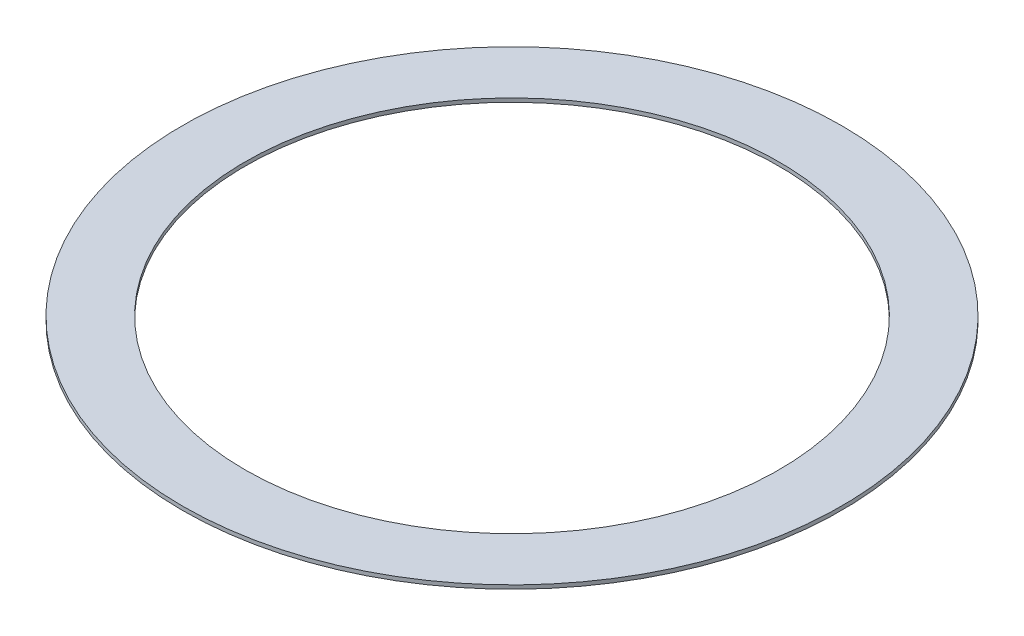
ISO-10303-21;
HEADER;
FILE_DESCRIPTION(('STEP AP214'),'2;1');
FILE_NAME('part.step','',(''),(''),'','','');
FILE_SCHEMA(('AUTOMOTIVE_DESIGN { 1 0 10303 214 1 1 1 1 }'));
ENDSEC;
DATA;
#1=APPLICATION_CONTEXT('core data for automotive mechanical design processes');
#2=APPLICATION_PROTOCOL_DEFINITION('international standard','automotive_design',2000,#1);
#3=PRODUCT_CONTEXT('',#1,'mechanical');
#4=PRODUCT('Part','Part','',(#3));
#5=PRODUCT_RELATED_PRODUCT_CATEGORY('part','',(#4));
#6=PRODUCT_DEFINITION_FORMATION('','',#4);
#7=PRODUCT_DEFINITION_CONTEXT('part definition',#1,'design');
#8=PRODUCT_DEFINITION('design','',#6,#7);
#9=PRODUCT_DEFINITION_SHAPE('','',#8);
#10=(LENGTH_UNIT() NAMED_UNIT(*) SI_UNIT(.MILLI.,.METRE.));
#11=(NAMED_UNIT(*) PLANE_ANGLE_UNIT() SI_UNIT($,.RADIAN.));
#12=(NAMED_UNIT(*) SI_UNIT($,.STERADIAN.) SOLID_ANGLE_UNIT());
#13=UNCERTAINTY_MEASURE_WITH_UNIT(LENGTH_MEASURE(1.E-05),#10,'distance_accuracy_value','');
#14=(GEOMETRIC_REPRESENTATION_CONTEXT(3) GLOBAL_UNCERTAINTY_ASSIGNED_CONTEXT((#13)) GLOBAL_UNIT_ASSIGNED_CONTEXT((#10,
#11,#12)) REPRESENTATION_CONTEXT('',''));
#15=CARTESIAN_POINT('',(0.,0.,0.));
#16=DIRECTION('',(0.,0.,1.));
#17=DIRECTION('',(1.,0.,0.));
#18=AXIS2_PLACEMENT_3D('',#15,#16,#17);
#19=CARTESIAN_POINT('',(0.,5.,0.));
#20=DIRECTION('',(0.,1.,0.));
#21=DIRECTION('',(0.,0.,1.));
#22=AXIS2_PLACEMENT_3D('',#19,#20,#21);
#23=PLANE('',#22);
#24=CARTESIAN_POINT('',(0.,5.,0.));
#25=DIRECTION('',(0.,1.,0.));
#26=DIRECTION('',(0.,0.,1.));
#27=AXIS2_PLACEMENT_3D('',#24,#25,#26);
#28=CIRCLE('',#27,435.);
#29=CARTESIAN_POINT('',(0.,5.,435.));
#30=VERTEX_POINT('',#29);
#31=EDGE_CURVE('E10',#30,#30,#28,.T.);
#32=ORIENTED_EDGE('',*,*,#31,.T.);
#33=EDGE_LOOP('',(#32));
#34=FACE_BOUND('',#33,.T.);
#35=CARTESIAN_POINT('',(0.,5.,0.));
#36=DIRECTION('',(0.,1.,0.));
#37=DIRECTION('',(0.,0.,1.));
#38=AXIS2_PLACEMENT_3D('',#35,#36,#37);
#39=CIRCLE('',#38,352.26);
#40=CARTESIAN_POINT('',(0.,5.,352.26));
#41=VERTEX_POINT('',#40);
#42=EDGE_CURVE('E50',#41,#41,#39,.T.);
#43=ORIENTED_EDGE('',*,*,#42,.F.);
#44=EDGE_LOOP('',(#43));
#45=FACE_BOUND('',#44,.T.);
#46=ADVANCED_FACE('F37',(#34,#45),#23,.T.);
#47=CARTESIAN_POINT('',(0.,0.,0.));
#48=DIRECTION('',(0.,1.,0.));
#49=DIRECTION('',(0.,0.,1.));
#50=AXIS2_PLACEMENT_3D('',#47,#48,#49);
#51=PLANE('',#50);
#52=CARTESIAN_POINT('',(0.,0.,0.));
#53=DIRECTION('',(0.,1.,0.));
#54=DIRECTION('',(0.,0.,1.));
#55=AXIS2_PLACEMENT_3D('',#52,#53,#54);
#56=CIRCLE('',#55,435.);
#57=CARTESIAN_POINT('',(0.,0.,435.));
#58=VERTEX_POINT('',#57);
#59=EDGE_CURVE('E41',#58,#58,#56,.T.);
#60=ORIENTED_EDGE('',*,*,#59,.F.);
#61=EDGE_LOOP('',(#60));
#62=FACE_BOUND('',#61,.T.);
#63=CARTESIAN_POINT('',(0.,0.,0.));
#64=DIRECTION('',(0.,1.,0.));
#65=DIRECTION('',(0.,0.,1.));
#66=AXIS2_PLACEMENT_3D('',#63,#64,#65);
#67=CIRCLE('',#66,352.26);
#68=CARTESIAN_POINT('',(0.,0.,352.26));
#69=VERTEX_POINT('',#68);
#70=EDGE_CURVE('E52',#69,#69,#67,.T.);
#71=ORIENTED_EDGE('',*,*,#70,.T.);
#72=EDGE_LOOP('',(#71));
#73=FACE_BOUND('',#72,.T.);
#74=ADVANCED_FACE('F64',(#62,#73),#51,.F.);
#75=CARTESIAN_POINT('',(0.,5.,0.));
#76=DIRECTION('',(0.,-1.,0.));
#77=DIRECTION('',(0.,0.,-1.));
#78=AXIS2_PLACEMENT_3D('',#75,#76,#77);
#79=CYLINDRICAL_SURFACE('',#78,435.);
#80=ORIENTED_EDGE('',*,*,#31,.F.);
#81=EDGE_LOOP('',(#80));
#82=FACE_BOUND('',#81,.T.);
#83=ORIENTED_EDGE('',*,*,#59,.T.);
#84=EDGE_LOOP('',(#83));
#85=FACE_BOUND('',#84,.T.);
#86=ADVANCED_FACE('F39',(#82,#85),#79,.T.);
#87=CARTESIAN_POINT('',(0.,5.,0.));
#88=DIRECTION('',(0.,-1.,0.));
#89=DIRECTION('',(0.,0.,-1.));
#90=AXIS2_PLACEMENT_3D('',#87,#88,#89);
#91=CYLINDRICAL_SURFACE('',#90,352.26);
#92=ORIENTED_EDGE('',*,*,#42,.T.);
#93=EDGE_LOOP('',(#92));
#94=FACE_BOUND('',#93,.T.);
#95=ORIENTED_EDGE('',*,*,#70,.F.);
#96=EDGE_LOOP('',(#95));
#97=FACE_BOUND('',#96,.T.);
#98=ADVANCED_FACE('F60',(#94,#97),#91,.F.);
#99=CLOSED_SHELL('',(#46,#74,#86,#98));
#100=MANIFOLD_SOLID_BREP('B2',#99);
#101=ADVANCED_BREP_SHAPE_REPRESENTATION('',(#18,#100),#14);
#102=SHAPE_DEFINITION_REPRESENTATION(#9,#101);
ENDSEC;
END-ISO-10303-21;
